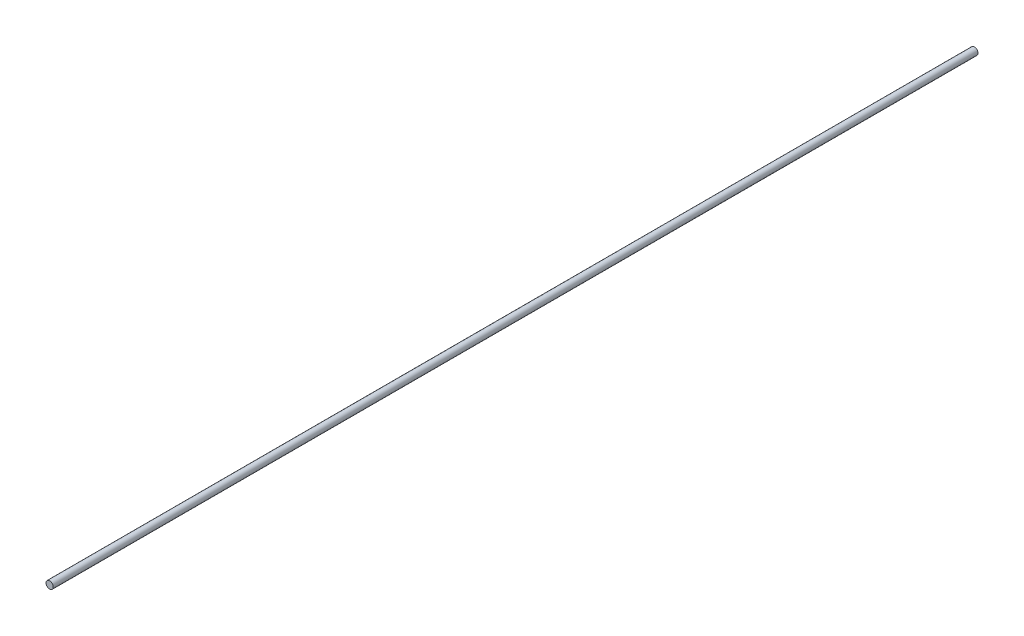
ISO-10303-21;
HEADER;
FILE_DESCRIPTION(('STEP AP214'),'2;1');
FILE_NAME('part.step','',(''),(''),'','','');
FILE_SCHEMA(('AUTOMOTIVE_DESIGN { 1 0 10303 214 1 1 1 1 }'));
ENDSEC;
DATA;
#1=APPLICATION_CONTEXT('core data for automotive mechanical design processes');
#2=APPLICATION_PROTOCOL_DEFINITION('international standard','automotive_design',2000,#1);
#3=PRODUCT_CONTEXT('',#1,'mechanical');
#4=PRODUCT('Part','Part','',(#3));
#5=PRODUCT_RELATED_PRODUCT_CATEGORY('part','',(#4));
#6=PRODUCT_DEFINITION_FORMATION('','',#4);
#7=PRODUCT_DEFINITION_CONTEXT('part definition',#1,'design');
#8=PRODUCT_DEFINITION('design','',#6,#7);
#9=PRODUCT_DEFINITION_SHAPE('','',#8);
#10=(LENGTH_UNIT() NAMED_UNIT(*) SI_UNIT(.MILLI.,.METRE.));
#11=(NAMED_UNIT(*) PLANE_ANGLE_UNIT() SI_UNIT($,.RADIAN.));
#12=(NAMED_UNIT(*) SI_UNIT($,.STERADIAN.) SOLID_ANGLE_UNIT());
#13=UNCERTAINTY_MEASURE_WITH_UNIT(LENGTH_MEASURE(1.E-05),#10,'distance_accuracy_value','');
#14=(GEOMETRIC_REPRESENTATION_CONTEXT(3) GLOBAL_UNCERTAINTY_ASSIGNED_CONTEXT((#13)) GLOBAL_UNIT_ASSIGNED_CONTEXT((#10,
#11,#12)) REPRESENTATION_CONTEXT('',''));
#15=CARTESIAN_POINT('',(0.,0.,0.));
#16=DIRECTION('',(0.,0.,1.));
#17=DIRECTION('',(1.,0.,0.));
#18=AXIS2_PLACEMENT_3D('',#15,#16,#17);
#19=CARTESIAN_POINT('',(0.,0.,508.));
#20=DIRECTION('',(0.,0.,-1.));
#21=DIRECTION('',(-1.,0.,0.));
#22=AXIS2_PLACEMENT_3D('',#19,#20,#21);
#23=CYLINDRICAL_SURFACE('',#22,1.984375);
#24=CARTESIAN_POINT('',(0.,0.,508.));
#25=DIRECTION('',(0.,0.,1.));
#26=DIRECTION('',(1.,0.,0.));
#27=AXIS2_PLACEMENT_3D('',#24,#25,#26);
#28=CIRCLE('',#27,1.984375);
#29=CARTESIAN_POINT('',(1.984375,0.,508.));
#30=VERTEX_POINT('',#29);
#31=EDGE_CURVE('E10',#30,#30,#28,.T.);
#32=ORIENTED_EDGE('',*,*,#31,.F.);
#33=EDGE_LOOP('',(#32));
#34=FACE_BOUND('',#33,.T.);
#35=CARTESIAN_POINT('',(0.,0.,0.));
#36=DIRECTION('',(0.,0.,1.));
#37=DIRECTION('',(1.,0.,0.));
#38=AXIS2_PLACEMENT_3D('',#35,#36,#37);
#39=CIRCLE('',#38,1.984375);
#40=CARTESIAN_POINT('',(1.984375,0.,0.));
#41=VERTEX_POINT('',#40);
#42=EDGE_CURVE('E34',#41,#41,#39,.T.);
#43=ORIENTED_EDGE('',*,*,#42,.T.);
#44=EDGE_LOOP('',(#43));
#45=FACE_BOUND('',#44,.T.);
#46=ADVANCED_FACE('F31',(#34,#45),#23,.T.);
#47=CARTESIAN_POINT('',(0.,0.,508.));
#48=DIRECTION('',(0.,0.,1.));
#49=DIRECTION('',(1.,0.,0.));
#50=AXIS2_PLACEMENT_3D('',#47,#48,#49);
#51=PLANE('',#50);
#52=ORIENTED_EDGE('',*,*,#31,.T.);
#53=EDGE_LOOP('',(#52));
#54=FACE_BOUND('',#53,.T.);
#55=ADVANCED_FACE('F46',(#54),#51,.T.);
#56=CARTESIAN_POINT('',(0.,0.,0.));
#57=DIRECTION('',(0.,0.,1.));
#58=DIRECTION('',(1.,0.,0.));
#59=AXIS2_PLACEMENT_3D('',#56,#57,#58);
#60=PLANE('',#59);
#61=ORIENTED_EDGE('',*,*,#42,.F.);
#62=EDGE_LOOP('',(#61));
#63=FACE_BOUND('',#62,.T.);
#64=ADVANCED_FACE('F44',(#63),#60,.F.);
#65=CLOSED_SHELL('',(#46,#55,#64));
#66=MANIFOLD_SOLID_BREP('B2',#65);
#67=ADVANCED_BREP_SHAPE_REPRESENTATION('',(#18,#66),#14);
#68=SHAPE_DEFINITION_REPRESENTATION(#9,#67);
ENDSEC;
END-ISO-10303-21;
